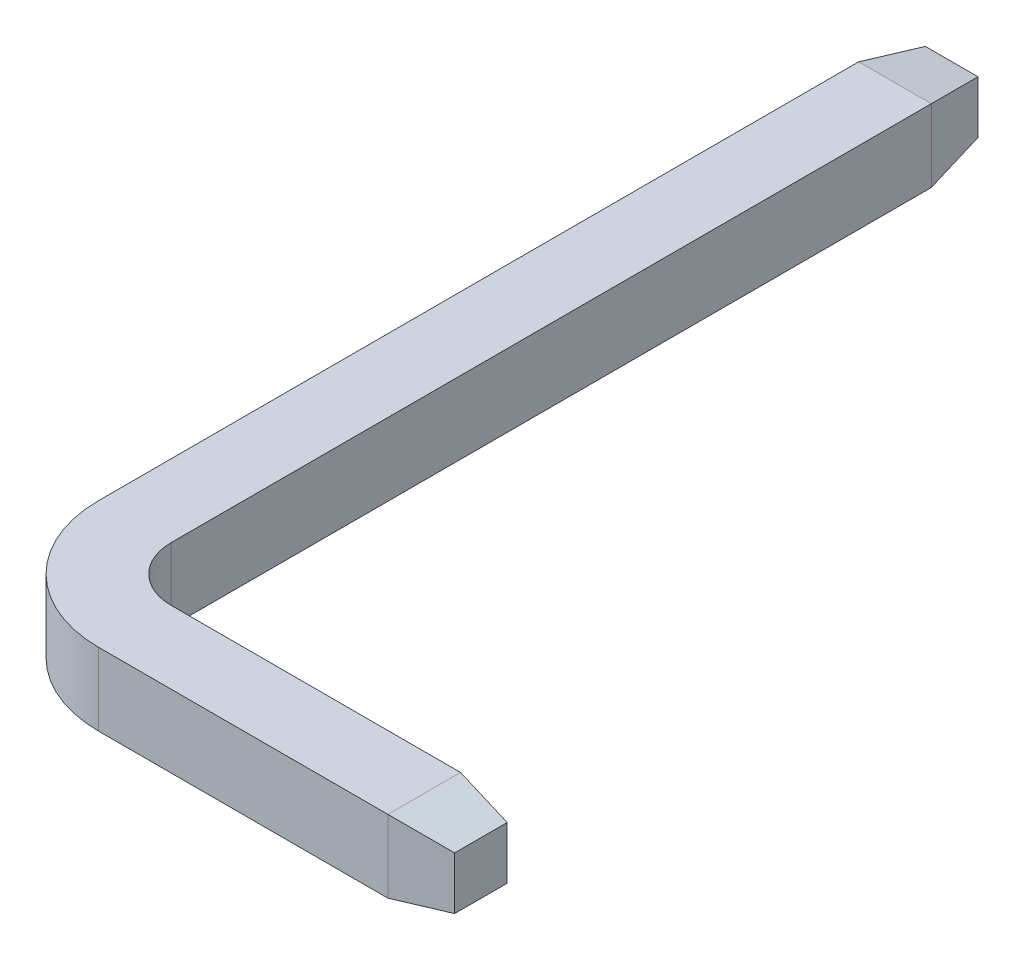
ISO-10303-21;
HEADER;
FILE_DESCRIPTION(('STEP AP214'),'2;1');
FILE_NAME('part.step','',(''),(''),'','','');
FILE_SCHEMA(('AUTOMOTIVE_DESIGN { 1 0 10303 214 1 1 1 1 }'));
ENDSEC;
DATA;
#1=APPLICATION_CONTEXT('core data for automotive mechanical design processes');
#2=APPLICATION_PROTOCOL_DEFINITION('international standard','automotive_design',2000,#1);
#3=PRODUCT_CONTEXT('',#1,'mechanical');
#4=PRODUCT('Part','Part','',(#3));
#5=PRODUCT_RELATED_PRODUCT_CATEGORY('part','',(#4));
#6=PRODUCT_DEFINITION_FORMATION('','',#4);
#7=PRODUCT_DEFINITION_CONTEXT('part definition',#1,'design');
#8=PRODUCT_DEFINITION('design','',#6,#7);
#9=PRODUCT_DEFINITION_SHAPE('','',#8);
#10=(LENGTH_UNIT() NAMED_UNIT(*) SI_UNIT(.MILLI.,.METRE.));
#11=(NAMED_UNIT(*) PLANE_ANGLE_UNIT() SI_UNIT($,.RADIAN.));
#12=(NAMED_UNIT(*) SI_UNIT($,.STERADIAN.) SOLID_ANGLE_UNIT());
#13=UNCERTAINTY_MEASURE_WITH_UNIT(LENGTH_MEASURE(1.E-05),#10,'distance_accuracy_value','');
#14=(GEOMETRIC_REPRESENTATION_CONTEXT(3) GLOBAL_UNCERTAINTY_ASSIGNED_CONTEXT((#13)) GLOBAL_UNIT_ASSIGNED_CONTEXT((#10,
#11,#12)) REPRESENTATION_CONTEXT('',''));
#15=CARTESIAN_POINT('',(0.,0.,0.));
#16=DIRECTION('',(0.,0.,1.));
#17=DIRECTION('',(1.,0.,0.));
#18=AXIS2_PLACEMENT_3D('',#15,#16,#17);
#19=CARTESIAN_POINT('',(3.528962305911,0.231836509646,-3.516332606812));
#20=DIRECTION('',(-0.173648177667033,-0.98480775301219,0.));
#21=DIRECTION('',(0.98480775301219,-0.173648177667033,0.));
#22=AXIS2_PLACEMENT_3D('',#19,#20,#21);
#23=PLANE('',#22);
#24=DIRECTION('',(0.,0.,1.));
#25=VECTOR('',#24,1.);
#26=CARTESIAN_POINT('',(3.528962305911,0.231836509646,-3.516332606812));
#27=LINE('',#26,#25);
#28=CARTESIAN_POINT('',(3.528962305911,0.231836509646,-2.963458403077));
#29=VERTEX_POINT('',#28);
#30=CARTESIAN_POINT('',(3.528962305911,0.231836509646,-3.427131422369));
#31=VERTEX_POINT('',#30);
#32=EDGE_CURVE('E206',#29,#31,#27,.F.);
#33=ORIENTED_EDGE('',*,*,#32,.T.);
#34=DIRECTION('',(0.970287525247869,-0.171087869745611,0.17108786974615));
#35=VECTOR('',#34,1.);
#36=CARTESIAN_POINT('',(3.02896230591105,0.32,-3.51529491272328));
#37=LINE('',#36,#35);
#38=CARTESIAN_POINT('',(3.02896230591101,0.32,-3.51529491272307));
#39=VERTEX_POINT('',#38);
#40=EDGE_CURVE('E185',#39,#31,#37,.T.);
#41=ORIENTED_EDGE('',*,*,#40,.F.);
#42=DIRECTION('',(0.,0.,-1.));
#43=VECTOR('',#42,1.);
#44=CARTESIAN_POINT('',(3.028962305911,0.32,-3.995294912723));
#45=LINE('',#44,#43);
#46=CARTESIAN_POINT('',(3.02896230591101,0.32,-2.87529491272293));
#47=VERTEX_POINT('',#46);
#48=EDGE_CURVE('E143',#39,#47,#45,.F.);
#49=ORIENTED_EDGE('',*,*,#48,.T.);
#50=DIRECTION('',(-0.970287525247869,0.171087869745611,0.17108786974615));
#51=VECTOR('',#50,1.);
#52=CARTESIAN_POINT('',(3.528962305911,0.231836509646,-2.963458403077));
#53=LINE('',#52,#51);
#54=EDGE_CURVE('E195',#29,#47,#53,.T.);
#55=ORIENTED_EDGE('',*,*,#54,.F.);
#56=EDGE_LOOP('',(#33,#41,#49,#55));
#57=FACE_BOUND('',#56,.T.);
#58=ADVANCED_FACE('F17',(#57),#23,.F.);
#59=CARTESIAN_POINT('',(-0.641037694089,0.32,-10.69529491272));
#60=DIRECTION('',(0.,0.98480775301219,-0.173648177667033));
#61=DIRECTION('',(0.,0.173648177667033,0.98480775301219));
#62=AXIS2_PLACEMENT_3D('',#59,#60,#61);
#63=PLANE('',#62);
#64=DIRECTION('',(0.17108786974615,-0.17108786974561,-0.970287525247869));
#65=VECTOR('',#64,1.);
#66=CARTESIAN_POINT('',(-0.641037694089,0.32,-10.69529491272));
#67=LINE('',#66,#65);
#68=CARTESIAN_POINT('',(-0.641037694089001,0.32,-10.69529491272));
#69=VERTEX_POINT('',#68);
#70=CARTESIAN_POINT('',(-0.552874203734722,0.231836509646,-11.19529491272));
#71=VERTEX_POINT('',#70);
#72=EDGE_CURVE('E146',#69,#71,#67,.T.);
#73=ORIENTED_EDGE('',*,*,#72,.F.);
#74=DIRECTION('',(1.,0.,0.));
#75=VECTOR('',#74,1.);
#76=CARTESIAN_POINT('',(-0.641037694089,0.32,-10.69529491272));
#77=LINE('',#76,#75);
#78=CARTESIAN_POINT('',(-0.00103769408891895,0.32,-10.69529491272));
#79=VERTEX_POINT('',#78);
#80=EDGE_CURVE('E122',#69,#79,#77,.T.);
#81=ORIENTED_EDGE('',*,*,#80,.T.);
#82=DIRECTION('',(0.17108786974615,0.171087869745597,0.970287525247871));
#83=VECTOR('',#82,1.);
#84=CARTESIAN_POINT('',(-0.089201184443204,0.231836509646,-11.19529491272));
#85=LINE('',#84,#83);
#86=CARTESIAN_POINT('',(-0.089201184443168,0.231836509646,-11.19529491272));
#87=VERTEX_POINT('',#86);
#88=EDGE_CURVE('E166',#87,#79,#85,.T.);
#89=ORIENTED_EDGE('',*,*,#88,.F.);
#90=DIRECTION('',(-1.,0.,0.));
#91=VECTOR('',#90,1.);
#92=CARTESIAN_POINT('',(0.,0.231836509646,-11.19529491272));
#93=LINE('',#92,#91);
#94=EDGE_CURVE('E163',#71,#87,#93,.F.);
#95=ORIENTED_EDGE('',*,*,#94,.F.);
#96=EDGE_LOOP('',(#73,#81,#89,#95));
#97=FACE_BOUND('',#96,.T.);
#98=ADVANCED_FACE('F341',(#97),#63,.T.);
#99=CARTESIAN_POINT('',(3.528962305911,0.,-3.516332606812));
#100=DIRECTION('',(-1.,0.,0.));
#101=DIRECTION('',(0.,0.,1.));
#102=AXIS2_PLACEMENT_3D('',#99,#100,#101);
#103=PLANE('',#102);
#104=DIRECTION('',(0.,1.,0.));
#105=VECTOR('',#104,1.);
#106=CARTESIAN_POINT('',(3.528962305911,0.,-3.427131422369));
#107=LINE('',#106,#105);
#108=CARTESIAN_POINT('',(3.528962305911,-0.231836509646,-3.427131422369));
#109=VERTEX_POINT('',#108);
#110=EDGE_CURVE('E168',#31,#109,#107,.F.);
#111=ORIENTED_EDGE('',*,*,#110,.F.);
#112=ORIENTED_EDGE('',*,*,#32,.F.);
#113=DIRECTION('',(0.,1.,0.));
#114=VECTOR('',#113,1.);
#115=CARTESIAN_POINT('',(3.528962305911,0.,-2.963458403077));
#116=LINE('',#115,#114);
#117=CARTESIAN_POINT('',(3.528962305911,-0.231836509646001,-2.963458403077));
#118=VERTEX_POINT('',#117);
#119=EDGE_CURVE('E187',#118,#29,#116,.T.);
#120=ORIENTED_EDGE('',*,*,#119,.F.);
#121=DIRECTION('',(0.,0.,1.));
#122=VECTOR('',#121,1.);
#123=CARTESIAN_POINT('',(3.528962305911,-0.231836509646,-3.516332606812));
#124=LINE('',#123,#122);
#125=EDGE_CURVE('E126',#118,#109,#124,.F.);
#126=ORIENTED_EDGE('',*,*,#125,.T.);
#127=EDGE_LOOP('',(#111,#112,#120,#126));
#128=FACE_BOUND('',#127,.T.);
#129=ADVANCED_FACE('F258',(#128),#103,.F.);
#130=CARTESIAN_POINT('',(3.528962305911,0.,-2.963458403077));
#131=DIRECTION('',(0.173648177667033,0.,0.98480775301219));
#132=DIRECTION('',(0.98480775301219,0.,-0.173648177667033));
#133=AXIS2_PLACEMENT_3D('',#130,#131,#132);
#134=PLANE('',#133);
#135=DIRECTION('',(0.970287525247869,0.17108786974615,-0.171087869745611));
#136=VECTOR('',#135,1.);
#137=CARTESIAN_POINT('',(3.02896230591105,-0.320000000000279,-2.875294912723));
#138=LINE('',#137,#136);
#139=CARTESIAN_POINT('',(3.02896230591101,-0.32000000000007,-2.875294912723));
#140=VERTEX_POINT('',#139);
#141=EDGE_CURVE('E182',#140,#118,#138,.T.);
#142=ORIENTED_EDGE('',*,*,#141,.T.);
#143=ORIENTED_EDGE('',*,*,#119,.T.);
#144=ORIENTED_EDGE('',*,*,#54,.T.);
#145=DIRECTION('',(0.,1.,0.));
#146=VECTOR('',#145,1.);
#147=CARTESIAN_POINT('',(3.028962305911,-0.32,-2.875294912723));
#148=LINE('',#147,#146);
#149=EDGE_CURVE('E111',#140,#47,#148,.T.);
#150=ORIENTED_EDGE('',*,*,#149,.F.);
#151=EDGE_LOOP('',(#142,#143,#144,#150));
#152=FACE_BOUND('',#151,.T.);
#153=ADVANCED_FACE('F249',(#152),#134,.T.);
#154=CARTESIAN_POINT('',(3.528962305911,0.,-3.427131422369));
#155=DIRECTION('',(0.173648177667033,0.,-0.98480775301219));
#156=DIRECTION('',(-0.98480775301219,0.,-0.173648177667033));
#157=AXIS2_PLACEMENT_3D('',#154,#155,#156);
#158=PLANE('',#157);
#159=ORIENTED_EDGE('',*,*,#40,.T.);
#160=ORIENTED_EDGE('',*,*,#110,.T.);
#161=DIRECTION('',(-0.970287525247869,-0.171087869746149,-0.171087869745612));
#162=VECTOR('',#161,1.);
#163=CARTESIAN_POINT('',(3.528962305911,-0.231836509646,-3.427131422369));
#164=LINE('',#163,#162);
#165=CARTESIAN_POINT('',(3.02896230591101,-0.320000000000069,-3.515294912723));
#166=VERTEX_POINT('',#165);
#167=EDGE_CURVE('E129',#109,#166,#164,.T.);
#168=ORIENTED_EDGE('',*,*,#167,.T.);
#169=DIRECTION('',(0.,1.,0.));
#170=VECTOR('',#169,1.);
#171=CARTESIAN_POINT('',(3.028962305911,-0.32,-3.515294912723));
#172=LINE('',#171,#170);
#173=EDGE_CURVE('E181',#39,#166,#172,.F.);
#174=ORIENTED_EDGE('',*,*,#173,.F.);
#175=EDGE_LOOP('',(#159,#160,#168,#174));
#176=FACE_BOUND('',#175,.T.);
#177=ADVANCED_FACE('F265',(#176),#158,.T.);
#178=CARTESIAN_POINT('',(-0.001037694088919,-0.32,-10.69529491272));
#179=DIRECTION('',(0.98480775301219,0.,-0.173648177667033));
#180=DIRECTION('',(-0.173648177667033,0.,-0.98480775301219));
#181=AXIS2_PLACEMENT_3D('',#178,#179,#180);
#182=PLANE('',#181);
#183=ORIENTED_EDGE('',*,*,#88,.T.);
#184=DIRECTION('',(0.,1.,0.));
#185=VECTOR('',#184,1.);
#186=CARTESIAN_POINT('',(-0.00103769408891891,-0.32,-10.69529491272));
#187=LINE('',#186,#185);
#188=CARTESIAN_POINT('',(-0.00103769408891843,-0.32,-10.69529491272));
#189=VERTEX_POINT('',#188);
#190=EDGE_CURVE('E174',#79,#189,#187,.F.);
#191=ORIENTED_EDGE('',*,*,#190,.T.);
#192=DIRECTION('',(0.171087869746046,-0.171087869746137,0.970287525247794));
#193=VECTOR('',#192,1.);
#194=CARTESIAN_POINT('',(-0.0892011844431498,-0.231836509645722,-11.19529491272));
#195=LINE('',#194,#193);
#196=CARTESIAN_POINT('',(-0.0892011844431498,-0.231836509645722,-11.19529491272));
#197=VERTEX_POINT('',#196);
#198=EDGE_CURVE('E291',#197,#189,#195,.T.);
#199=ORIENTED_EDGE('',*,*,#198,.F.);
#200=DIRECTION('',(0.,1.,0.));
#201=VECTOR('',#200,1.);
#202=CARTESIAN_POINT('',(-0.08920118444315,0.,-11.19529491272));
#203=LINE('',#202,#201);
#204=EDGE_CURVE('E149',#87,#197,#203,.F.);
#205=ORIENTED_EDGE('',*,*,#204,.F.);
#206=EDGE_LOOP('',(#183,#191,#199,#205));
#207=FACE_BOUND('',#206,.T.);
#208=ADVANCED_FACE('F300',(#207),#182,.T.);
#209=CARTESIAN_POINT('',(0.,0.,-11.19529491272));
#210=DIRECTION('',(0.,0.,-1.));
#211=DIRECTION('',(-1.,0.,0.));
#212=AXIS2_PLACEMENT_3D('',#209,#210,#211);
#213=PLANE('',#212);
#214=ORIENTED_EDGE('',*,*,#94,.T.);
#215=ORIENTED_EDGE('',*,*,#204,.T.);
#216=DIRECTION('',(1.,0.,0.));
#217=VECTOR('',#216,1.);
#218=CARTESIAN_POINT('',(-0.641037694089,-0.231836509645722,-11.19529491272));
#219=LINE('',#218,#217);
#220=CARTESIAN_POINT('',(-0.552874203734907,-0.231836509645722,-11.19529491272));
#221=VERTEX_POINT('',#220);
#222=EDGE_CURVE('E155',#221,#197,#219,.T.);
#223=ORIENTED_EDGE('',*,*,#222,.F.);
#224=DIRECTION('',(0.,1.,0.));
#225=VECTOR('',#224,1.);
#226=CARTESIAN_POINT('',(-0.552874203734722,-0.32,-11.19529491272));
#227=LINE('',#226,#225);
#228=EDGE_CURVE('E148',#71,#221,#227,.F.);
#229=ORIENTED_EDGE('',*,*,#228,.F.);
#230=EDGE_LOOP('',(#214,#215,#223,#229));
#231=FACE_BOUND('',#230,.T.);
#232=ADVANCED_FACE('F337',(#231),#213,.T.);
#233=CARTESIAN_POINT('',(-0.641037694089,-0.32,-10.69529491272));
#234=DIRECTION('',(-0.98480775301219,0.,-0.173648177667033));
#235=DIRECTION('',(-0.173648177667033,0.,0.98480775301219));
#236=AXIS2_PLACEMENT_3D('',#233,#234,#235);
#237=PLANE('',#236);
#238=DIRECTION('',(0.171087869745611,0.17108786974615,-0.970287525247869));
#239=VECTOR('',#238,1.);
#240=CARTESIAN_POINT('',(-0.641037694089,-0.32,-10.69529491272));
#241=LINE('',#240,#239);
#242=CARTESIAN_POINT('',(-0.641037694089,-0.32,-10.69529491272));
#243=VERTEX_POINT('',#242);
#244=EDGE_CURVE('E159',#243,#221,#241,.T.);
#245=ORIENTED_EDGE('',*,*,#244,.F.);
#246=DIRECTION('',(0.,1.,0.));
#247=VECTOR('',#246,1.);
#248=CARTESIAN_POINT('',(-0.641037694089001,-0.32,-10.69529491272));
#249=LINE('',#248,#247);
#250=EDGE_CURVE('E34',#243,#69,#249,.T.);
#251=ORIENTED_EDGE('',*,*,#250,.T.);
#252=ORIENTED_EDGE('',*,*,#72,.T.);
#253=ORIENTED_EDGE('',*,*,#228,.T.);
#254=EDGE_LOOP('',(#245,#251,#252,#253));
#255=FACE_BOUND('',#254,.T.);
#256=ADVANCED_FACE('F342',(#255),#237,.T.);
#257=CARTESIAN_POINT('',(-0.641037694089,0.32,-3.995294912723));
#258=DIRECTION('',(0.,-1.,0.));
#259=DIRECTION('',(0.,0.,-1.));
#260=AXIS2_PLACEMENT_3D('',#257,#258,#259);
#261=PLANE('',#260);
#262=ORIENTED_EDGE('',*,*,#80,.F.);
#263=DIRECTION('',(0.,0.,-1.));
#264=VECTOR('',#263,1.);
#265=CARTESIAN_POINT('',(-0.641037694089,0.32,-3.995294912723));
#266=LINE('',#265,#264);
#267=CARTESIAN_POINT('',(-0.641037694089,0.32,-3.995294912723));
#268=VERTEX_POINT('',#267);
#269=EDGE_CURVE('E118',#69,#268,#266,.F.);
#270=ORIENTED_EDGE('',*,*,#269,.T.);
#271=CARTESIAN_POINT('',(0.478962305911,0.32,-3.995294912723));
#272=DIRECTION('',(0.,1.,0.));
#273=DIRECTION('',(0.,0.,1.));
#274=AXIS2_PLACEMENT_3D('',#271,#272,#273);
#275=CIRCLE('',#274,1.12);
#276=CARTESIAN_POINT('',(0.478962305911,0.32,-2.875294912723));
#277=VERTEX_POINT('',#276);
#278=EDGE_CURVE('E20',#277,#268,#275,.F.);
#279=ORIENTED_EDGE('',*,*,#278,.F.);
#280=DIRECTION('',(1.,0.,0.));
#281=VECTOR('',#280,1.);
#282=CARTESIAN_POINT('',(0.478962305911,0.32,-2.875294912723));
#283=LINE('',#282,#281);
#284=EDGE_CURVE('E103',#47,#277,#283,.F.);
#285=ORIENTED_EDGE('',*,*,#284,.F.);
#286=ORIENTED_EDGE('',*,*,#48,.F.);
#287=DIRECTION('',(-1.,0.,0.));
#288=VECTOR('',#287,1.);
#289=CARTESIAN_POINT('',(0.478962305911,0.32,-3.515294912723));
#290=LINE('',#289,#288);
#291=CARTESIAN_POINT('',(0.478962305911,0.32,-3.515294912723));
#292=VERTEX_POINT('',#291);
#293=EDGE_CURVE('E178',#292,#39,#290,.F.);
#294=ORIENTED_EDGE('',*,*,#293,.F.);
#295=CARTESIAN_POINT('',(0.478962305911,0.32,-3.995294912723));
#296=DIRECTION('',(0.,1.,0.));
#297=DIRECTION('',(0.,0.,1.));
#298=AXIS2_PLACEMENT_3D('',#295,#296,#297);
#299=CIRCLE('',#298,0.48);
#300=CARTESIAN_POINT('',(-0.00103769408891801,0.32,-3.995294912723));
#301=VERTEX_POINT('',#300);
#302=EDGE_CURVE('E222',#292,#301,#299,.F.);
#303=ORIENTED_EDGE('',*,*,#302,.T.);
#304=DIRECTION('',(0.,0.,1.));
#305=VECTOR('',#304,1.);
#306=CARTESIAN_POINT('',(-0.001037694088918,0.32,-3.995294912723));
#307=LINE('',#306,#305);
#308=EDGE_CURVE('E171',#301,#79,#307,.F.);
#309=ORIENTED_EDGE('',*,*,#308,.T.);
#310=EDGE_LOOP('',(#262,#270,#279,#285,#286,#294,#303,#309));
#311=FACE_BOUND('',#310,.T.);
#312=ADVANCED_FACE('F117',(#311),#261,.F.);
#313=CARTESIAN_POINT('',(0.478962305911,0.,-3.995294912723));
#314=DIRECTION('',(0.,1.,0.));
#315=DIRECTION('',(0.,0.,1.));
#316=AXIS2_PLACEMENT_3D('',#313,#314,#315);
#317=CYLINDRICAL_SURFACE('',#316,1.12);
#318=DIRECTION('',(0.,1.,0.));
#319=VECTOR('',#318,1.);
#320=CARTESIAN_POINT('',(0.478962305911,-0.32,-2.875294912723));
#321=LINE('',#320,#319);
#322=CARTESIAN_POINT('',(0.478962305911,-0.32,-2.875294912723));
#323=VERTEX_POINT('',#322);
#324=EDGE_CURVE('E108',#277,#323,#321,.F.);
#325=ORIENTED_EDGE('',*,*,#324,.F.);
#326=ORIENTED_EDGE('',*,*,#278,.T.);
#327=DIRECTION('',(0.,1.,0.));
#328=VECTOR('',#327,1.);
#329=CARTESIAN_POINT('',(-0.641037694089,-0.32,-3.995294912723));
#330=LINE('',#329,#328);
#331=CARTESIAN_POINT('',(-0.641037694089,-0.32,-3.995294912723));
#332=VERTEX_POINT('',#331);
#333=EDGE_CURVE('E158',#268,#332,#330,.F.);
#334=ORIENTED_EDGE('',*,*,#333,.T.);
#335=CARTESIAN_POINT('',(0.478962305911,-0.32,-3.995294912723));
#336=DIRECTION('',(0.,1.,0.));
#337=DIRECTION('',(0.,0.,1.));
#338=AXIS2_PLACEMENT_3D('',#335,#336,#337);
#339=CIRCLE('',#338,1.12);
#340=EDGE_CURVE('E125',#332,#323,#339,.T.);
#341=ORIENTED_EDGE('',*,*,#340,.T.);
#342=EDGE_LOOP('',(#325,#326,#334,#341));
#343=FACE_BOUND('',#342,.T.);
#344=ADVANCED_FACE('F124',(#343),#317,.T.);
#345=CARTESIAN_POINT('',(0.478962305911,-0.32,-2.875294912723));
#346=DIRECTION('',(0.,0.,1.));
#347=DIRECTION('',(1.,0.,0.));
#348=AXIS2_PLACEMENT_3D('',#345,#346,#347);
#349=PLANE('',#348);
#350=ORIENTED_EDGE('',*,*,#284,.T.);
#351=ORIENTED_EDGE('',*,*,#324,.T.);
#352=DIRECTION('',(1.,0.,0.));
#353=VECTOR('',#352,1.);
#354=CARTESIAN_POINT('',(-0.641037694089,-0.32,-2.875294912723));
#355=LINE('',#354,#353);
#356=EDGE_CURVE('E221',#323,#140,#355,.T.);
#357=ORIENTED_EDGE('',*,*,#356,.T.);
#358=ORIENTED_EDGE('',*,*,#149,.T.);
#359=EDGE_LOOP('',(#350,#351,#357,#358));
#360=FACE_BOUND('',#359,.T.);
#361=ADVANCED_FACE('F105',(#360),#349,.T.);
#362=CARTESIAN_POINT('',(3.528962305911,-0.231836509646,-3.516332606812));
#363=DIRECTION('',(-0.173648177667033,0.98480775301219,0.));
#364=DIRECTION('',(-0.98480775301219,-0.173648177667033,0.));
#365=AXIS2_PLACEMENT_3D('',#362,#363,#364);
#366=PLANE('',#365);
#367=DIRECTION('',(0.,0.,1.));
#368=VECTOR('',#367,1.);
#369=CARTESIAN_POINT('',(3.028962305911,-0.32,-3.995294912723));
#370=LINE('',#369,#368);
#371=EDGE_CURVE('E239',#140,#166,#370,.F.);
#372=ORIENTED_EDGE('',*,*,#371,.T.);
#373=ORIENTED_EDGE('',*,*,#167,.F.);
#374=ORIENTED_EDGE('',*,*,#125,.F.);
#375=ORIENTED_EDGE('',*,*,#141,.F.);
#376=EDGE_LOOP('',(#372,#373,#374,#375));
#377=FACE_BOUND('',#376,.T.);
#378=ADVANCED_FACE('F254',(#377),#366,.F.);
#379=CARTESIAN_POINT('',(0.478962305911,-0.32,-3.515294912723));
#380=DIRECTION('',(0.,0.,-1.));
#381=DIRECTION('',(-1.,0.,0.));
#382=AXIS2_PLACEMENT_3D('',#379,#380,#381);
#383=PLANE('',#382);
#384=DIRECTION('',(1.,0.,0.));
#385=VECTOR('',#384,1.);
#386=CARTESIAN_POINT('',(-0.641037694089,-0.32,-3.515294912723));
#387=LINE('',#386,#385);
#388=CARTESIAN_POINT('',(0.478962305911,-0.32,-3.515294912723));
#389=VERTEX_POINT('',#388);
#390=EDGE_CURVE('E220',#166,#389,#387,.F.);
#391=ORIENTED_EDGE('',*,*,#390,.T.);
#392=DIRECTION('',(0.,1.,0.));
#393=VECTOR('',#392,1.);
#394=CARTESIAN_POINT('',(0.478962305911,0.,-3.515294912723));
#395=LINE('',#394,#393);
#396=EDGE_CURVE('E223',#389,#292,#395,.T.);
#397=ORIENTED_EDGE('',*,*,#396,.T.);
#398=ORIENTED_EDGE('',*,*,#293,.T.);
#399=ORIENTED_EDGE('',*,*,#173,.T.);
#400=EDGE_LOOP('',(#391,#397,#398,#399));
#401=FACE_BOUND('',#400,.T.);
#402=ADVANCED_FACE('F262',(#401),#383,.T.);
#403=CARTESIAN_POINT('',(0.478962305911,0.,-3.995294912723));
#404=DIRECTION('',(0.,1.,0.));
#405=DIRECTION('',(0.,0.,1.));
#406=AXIS2_PLACEMENT_3D('',#403,#404,#405);
#407=CYLINDRICAL_SURFACE('',#406,0.48);
#408=ORIENTED_EDGE('',*,*,#302,.F.);
#409=ORIENTED_EDGE('',*,*,#396,.F.);
#410=CARTESIAN_POINT('',(0.478962305911,-0.32,-3.995294912723));
#411=DIRECTION('',(0.,1.,0.));
#412=DIRECTION('',(0.,0.,1.));
#413=AXIS2_PLACEMENT_3D('',#410,#411,#412);
#414=CIRCLE('',#413,0.48);
#415=CARTESIAN_POINT('',(-0.00103769408891802,-0.32,-3.995294912723));
#416=VERTEX_POINT('',#415);
#417=EDGE_CURVE('E216',#389,#416,#414,.F.);
#418=ORIENTED_EDGE('',*,*,#417,.T.);
#419=DIRECTION('',(0.,1.,0.));
#420=VECTOR('',#419,1.);
#421=CARTESIAN_POINT('',(-0.001037694088918,-0.32,-3.995294912723));
#422=LINE('',#421,#420);
#423=EDGE_CURVE('E175',#416,#301,#422,.T.);
#424=ORIENTED_EDGE('',*,*,#423,.T.);
#425=EDGE_LOOP('',(#408,#409,#418,#424));
#426=FACE_BOUND('',#425,.T.);
#427=ADVANCED_FACE('F311',(#426),#407,.F.);
#428=CARTESIAN_POINT('',(-0.001037694088918,-0.32,-3.995294912723));
#429=DIRECTION('',(-1.,0.,0.));
#430=DIRECTION('',(0.,0.,1.));
#431=AXIS2_PLACEMENT_3D('',#428,#429,#430);
#432=PLANE('',#431);
#433=ORIENTED_EDGE('',*,*,#190,.F.);
#434=ORIENTED_EDGE('',*,*,#308,.F.);
#435=ORIENTED_EDGE('',*,*,#423,.F.);
#436=DIRECTION('',(0.,0.,1.));
#437=VECTOR('',#436,1.);
#438=CARTESIAN_POINT('',(-0.00103769408891802,-0.32,-3.995294912723));
#439=LINE('',#438,#437);
#440=EDGE_CURVE('E219',#416,#189,#439,.F.);
#441=ORIENTED_EDGE('',*,*,#440,.T.);
#442=EDGE_LOOP('',(#433,#434,#435,#441));
#443=FACE_BOUND('',#442,.T.);
#444=ADVANCED_FACE('F307',(#443),#432,.F.);
#445=CARTESIAN_POINT('',(-0.641037694089,-0.32,-10.69529491272));
#446=DIRECTION('',(0.,-0.98480775301219,-0.173648177667033));
#447=DIRECTION('',(0.,0.173648177667033,-0.98480775301219));
#448=AXIS2_PLACEMENT_3D('',#445,#446,#447);
#449=PLANE('',#448);
#450=ORIENTED_EDGE('',*,*,#244,.T.);
#451=ORIENTED_EDGE('',*,*,#222,.T.);
#452=ORIENTED_EDGE('',*,*,#198,.T.);
#453=DIRECTION('',(1.,0.,0.));
#454=VECTOR('',#453,1.);
#455=CARTESIAN_POINT('',(-0.641037694089,-0.32,-10.69529491272));
#456=LINE('',#455,#454);
#457=EDGE_CURVE('E26',#189,#243,#456,.F.);
#458=ORIENTED_EDGE('',*,*,#457,.T.);
#459=EDGE_LOOP('',(#450,#451,#452,#458));
#460=FACE_BOUND('',#459,.T.);
#461=ADVANCED_FACE('F319',(#460),#449,.T.);
#462=CARTESIAN_POINT('',(-0.641037694089,-0.32,-3.995294912723));
#463=DIRECTION('',(1.,0.,0.));
#464=DIRECTION('',(0.,0.,-1.));
#465=AXIS2_PLACEMENT_3D('',#462,#463,#464);
#466=PLANE('',#465);
#467=ORIENTED_EDGE('',*,*,#250,.F.);
#468=DIRECTION('',(0.,0.,1.));
#469=VECTOR('',#468,1.);
#470=CARTESIAN_POINT('',(-0.641037694089,-0.32,-3.995294912723));
#471=LINE('',#470,#469);
#472=EDGE_CURVE('E11',#243,#332,#471,.T.);
#473=ORIENTED_EDGE('',*,*,#472,.T.);
#474=ORIENTED_EDGE('',*,*,#333,.F.);
#475=ORIENTED_EDGE('',*,*,#269,.F.);
#476=EDGE_LOOP('',(#467,#473,#474,#475));
#477=FACE_BOUND('',#476,.T.);
#478=ADVANCED_FACE('F323',(#477),#466,.F.);
#479=CARTESIAN_POINT('',(-0.641037694089,-0.32,-3.995294912723));
#480=DIRECTION('',(0.,1.,0.));
#481=DIRECTION('',(0.,0.,1.));
#482=AXIS2_PLACEMENT_3D('',#479,#480,#481);
#483=PLANE('',#482);
#484=ORIENTED_EDGE('',*,*,#457,.F.);
#485=ORIENTED_EDGE('',*,*,#440,.F.);
#486=ORIENTED_EDGE('',*,*,#417,.F.);
#487=ORIENTED_EDGE('',*,*,#390,.F.);
#488=ORIENTED_EDGE('',*,*,#371,.F.);
#489=ORIENTED_EDGE('',*,*,#356,.F.);
#490=ORIENTED_EDGE('',*,*,#340,.F.);
#491=ORIENTED_EDGE('',*,*,#472,.F.);
#492=EDGE_LOOP('',(#484,#485,#486,#487,#488,#489,#490,#491));
#493=FACE_BOUND('',#492,.T.);
#494=ADVANCED_FACE('F269',(#493),#483,.F.);
#495=CLOSED_SHELL('',(#58,#98,#129,#153,#177,#208,#232,#256,#312,#344,#361,#378,#402,#427,#444,
#461,#478,#494));
#496=MANIFOLD_SOLID_BREP('B1',#495);
#497=ADVANCED_BREP_SHAPE_REPRESENTATION('',(#18,#496),#14);
#498=SHAPE_DEFINITION_REPRESENTATION(#9,#497);
ENDSEC;
END-ISO-10303-21;
